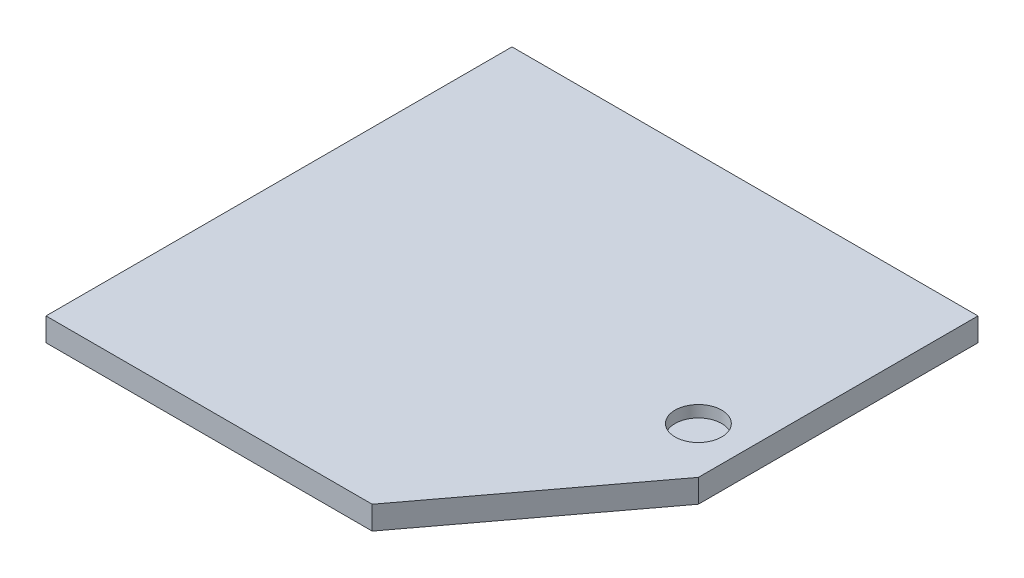
ISO-10303-21;
HEADER;
FILE_DESCRIPTION(('STEP AP214'),'2;1');
FILE_NAME('part.step','',(''),(''),'','','');
FILE_SCHEMA(('AUTOMOTIVE_DESIGN { 1 0 10303 214 1 1 1 1 }'));
ENDSEC;
DATA;
#1=APPLICATION_CONTEXT('core data for automotive mechanical design processes');
#2=APPLICATION_PROTOCOL_DEFINITION('international standard','automotive_design',2000,#1);
#3=PRODUCT_CONTEXT('',#1,'mechanical');
#4=PRODUCT('Part','Part','',(#3));
#5=PRODUCT_RELATED_PRODUCT_CATEGORY('part','',(#4));
#6=PRODUCT_DEFINITION_FORMATION('','',#4);
#7=PRODUCT_DEFINITION_CONTEXT('part definition',#1,'design');
#8=PRODUCT_DEFINITION('design','',#6,#7);
#9=PRODUCT_DEFINITION_SHAPE('','',#8);
#10=(LENGTH_UNIT() NAMED_UNIT(*) SI_UNIT(.MILLI.,.METRE.));
#11=(NAMED_UNIT(*) PLANE_ANGLE_UNIT() SI_UNIT($,.RADIAN.));
#12=(NAMED_UNIT(*) SI_UNIT($,.STERADIAN.) SOLID_ANGLE_UNIT());
#13=UNCERTAINTY_MEASURE_WITH_UNIT(LENGTH_MEASURE(1.E-05),#10,'distance_accuracy_value','');
#14=(GEOMETRIC_REPRESENTATION_CONTEXT(3) GLOBAL_UNCERTAINTY_ASSIGNED_CONTEXT((#13)) GLOBAL_UNIT_ASSIGNED_CONTEXT((#10,
#11,#12)) REPRESENTATION_CONTEXT('',''));
#15=CARTESIAN_POINT('',(0.,0.,0.));
#16=DIRECTION('',(0.,0.,1.));
#17=DIRECTION('',(1.,0.,0.));
#18=AXIS2_PLACEMENT_3D('',#15,#16,#17);
#19=CARTESIAN_POINT('',(0.,10.,0.));
#20=DIRECTION('',(1.,0.,0.));
#21=DIRECTION('',(0.,0.,-1.));
#22=AXIS2_PLACEMENT_3D('',#19,#20,#21);
#23=PLANE('',#22);
#24=DIRECTION('',(0.,0.,1.));
#25=VECTOR('',#24,1.);
#26=CARTESIAN_POINT('',(0.,0.,0.));
#27=LINE('',#26,#25);
#28=CARTESIAN_POINT('',(0.,0.,-200.));
#29=VERTEX_POINT('',#28);
#30=CARTESIAN_POINT('',(0.,0.,0.));
#31=VERTEX_POINT('',#30);
#32=EDGE_CURVE('E110',#29,#31,#27,.T.);
#33=ORIENTED_EDGE('',*,*,#32,.T.);
#34=DIRECTION('',(0.,-1.,0.));
#35=VECTOR('',#34,1.);
#36=CARTESIAN_POINT('',(0.,10.,0.));
#37=LINE('',#36,#35);
#38=CARTESIAN_POINT('',(0.,10.,0.));
#39=VERTEX_POINT('',#38);
#40=EDGE_CURVE('E11',#39,#31,#37,.T.);
#41=ORIENTED_EDGE('',*,*,#40,.F.);
#42=DIRECTION('',(0.,0.,1.));
#43=VECTOR('',#42,1.);
#44=CARTESIAN_POINT('',(0.,10.,0.));
#45=LINE('',#44,#43);
#46=CARTESIAN_POINT('',(0.,10.,-200.));
#47=VERTEX_POINT('',#46);
#48=EDGE_CURVE('E120',#47,#39,#45,.T.);
#49=ORIENTED_EDGE('',*,*,#48,.F.);
#50=DIRECTION('',(0.,-1.,0.));
#51=VECTOR('',#50,1.);
#52=CARTESIAN_POINT('',(0.,10.,-200.));
#53=LINE('',#52,#51);
#54=EDGE_CURVE('E106',#47,#29,#53,.T.);
#55=ORIENTED_EDGE('',*,*,#54,.T.);
#56=EDGE_LOOP('',(#33,#41,#49,#55));
#57=FACE_BOUND('',#56,.T.);
#58=ADVANCED_FACE('F35',(#57),#23,.F.);
#59=CARTESIAN_POINT('',(0.,10.,0.));
#60=DIRECTION('',(0.,0.,-1.));
#61=DIRECTION('',(-1.,0.,0.));
#62=AXIS2_PLACEMENT_3D('',#59,#60,#61);
#63=PLANE('',#62);
#64=DIRECTION('',(1.,0.,0.));
#65=VECTOR('',#64,1.);
#66=CARTESIAN_POINT('',(0.,0.,0.));
#67=LINE('',#66,#65);
#68=CARTESIAN_POINT('',(140.,0.,0.));
#69=VERTEX_POINT('',#68);
#70=EDGE_CURVE('E113',#31,#69,#67,.T.);
#71=ORIENTED_EDGE('',*,*,#70,.T.);
#72=DIRECTION('',(0.,-1.,0.));
#73=VECTOR('',#72,1.);
#74=CARTESIAN_POINT('',(140.,10.,0.));
#75=LINE('',#74,#73);
#76=CARTESIAN_POINT('',(140.,10.,0.));
#77=VERTEX_POINT('',#76);
#78=EDGE_CURVE('E43',#77,#69,#75,.T.);
#79=ORIENTED_EDGE('',*,*,#78,.F.);
#80=DIRECTION('',(1.,0.,0.));
#81=VECTOR('',#80,1.);
#82=CARTESIAN_POINT('',(0.,10.,0.));
#83=LINE('',#82,#81);
#84=EDGE_CURVE('E82',#39,#77,#83,.T.);
#85=ORIENTED_EDGE('',*,*,#84,.F.);
#86=ORIENTED_EDGE('',*,*,#40,.T.);
#87=EDGE_LOOP('',(#71,#79,#85,#86));
#88=FACE_BOUND('',#87,.T.);
#89=ADVANCED_FACE('F152',(#88),#63,.F.);
#90=CARTESIAN_POINT('',(200.,10.,-80.));
#91=DIRECTION('',(-0.8,0.,-0.6));
#92=DIRECTION('',(-0.6,0.,0.8));
#93=AXIS2_PLACEMENT_3D('',#90,#91,#92);
#94=PLANE('',#93);
#95=DIRECTION('',(0.6,0.,-0.8));
#96=VECTOR('',#95,1.);
#97=CARTESIAN_POINT('',(200.,0.,-80.));
#98=LINE('',#97,#96);
#99=CARTESIAN_POINT('',(200.,0.,-80.));
#100=VERTEX_POINT('',#99);
#101=EDGE_CURVE('E100',#69,#100,#98,.T.);
#102=ORIENTED_EDGE('',*,*,#101,.T.);
#103=DIRECTION('',(0.,-1.,0.));
#104=VECTOR('',#103,1.);
#105=CARTESIAN_POINT('',(200.,10.,-80.));
#106=LINE('',#105,#104);
#107=CARTESIAN_POINT('',(200.,10.,-80.));
#108=VERTEX_POINT('',#107);
#109=EDGE_CURVE('E97',#108,#100,#106,.T.);
#110=ORIENTED_EDGE('',*,*,#109,.F.);
#111=DIRECTION('',(0.6,0.,-0.8));
#112=VECTOR('',#111,1.);
#113=CARTESIAN_POINT('',(200.,10.,-80.));
#114=LINE('',#113,#112);
#115=EDGE_CURVE('E86',#77,#108,#114,.T.);
#116=ORIENTED_EDGE('',*,*,#115,.F.);
#117=ORIENTED_EDGE('',*,*,#78,.T.);
#118=EDGE_LOOP('',(#102,#110,#116,#117));
#119=FACE_BOUND('',#118,.T.);
#120=ADVANCED_FACE('F98',(#119),#94,.F.);
#121=CARTESIAN_POINT('',(200.,10.,-200.));
#122=DIRECTION('',(-1.,0.,0.));
#123=DIRECTION('',(0.,0.,1.));
#124=AXIS2_PLACEMENT_3D('',#121,#122,#123);
#125=PLANE('',#124);
#126=DIRECTION('',(0.,0.,-1.));
#127=VECTOR('',#126,1.);
#128=CARTESIAN_POINT('',(200.,0.,-200.));
#129=LINE('',#128,#127);
#130=CARTESIAN_POINT('',(200.,0.,-200.));
#131=VERTEX_POINT('',#130);
#132=EDGE_CURVE('E117',#100,#131,#129,.T.);
#133=ORIENTED_EDGE('',*,*,#132,.T.);
#134=DIRECTION('',(0.,-1.,0.));
#135=VECTOR('',#134,1.);
#136=CARTESIAN_POINT('',(200.,10.,-200.));
#137=LINE('',#136,#135);
#138=CARTESIAN_POINT('',(200.,10.,-200.));
#139=VERTEX_POINT('',#138);
#140=EDGE_CURVE('E102',#139,#131,#137,.T.);
#141=ORIENTED_EDGE('',*,*,#140,.F.);
#142=DIRECTION('',(0.,0.,-1.));
#143=VECTOR('',#142,1.);
#144=CARTESIAN_POINT('',(200.,10.,-80.));
#145=LINE('',#144,#143);
#146=EDGE_CURVE('E90',#108,#139,#145,.T.);
#147=ORIENTED_EDGE('',*,*,#146,.F.);
#148=ORIENTED_EDGE('',*,*,#109,.T.);
#149=EDGE_LOOP('',(#133,#141,#147,#148));
#150=FACE_BOUND('',#149,.T.);
#151=ADVANCED_FACE('F104',(#150),#125,.F.);
#152=CARTESIAN_POINT('',(0.,10.,-200.));
#153=DIRECTION('',(0.,0.,1.));
#154=DIRECTION('',(1.,0.,0.));
#155=AXIS2_PLACEMENT_3D('',#152,#153,#154);
#156=PLANE('',#155);
#157=DIRECTION('',(-1.,0.,0.));
#158=VECTOR('',#157,1.);
#159=CARTESIAN_POINT('',(0.,0.,-200.));
#160=LINE('',#159,#158);
#161=EDGE_CURVE('E70',#131,#29,#160,.T.);
#162=ORIENTED_EDGE('',*,*,#161,.T.);
#163=ORIENTED_EDGE('',*,*,#54,.F.);
#164=DIRECTION('',(-1.,0.,0.));
#165=VECTOR('',#164,1.);
#166=CARTESIAN_POINT('',(140.,10.,-200.));
#167=LINE('',#166,#165);
#168=EDGE_CURVE('E51',#139,#47,#167,.T.);
#169=ORIENTED_EDGE('',*,*,#168,.F.);
#170=ORIENTED_EDGE('',*,*,#140,.T.);
#171=EDGE_LOOP('',(#162,#163,#169,#170));
#172=FACE_BOUND('',#171,.T.);
#173=ADVANCED_FACE('F123',(#172),#156,.F.);
#174=CARTESIAN_POINT('',(0.,10.,0.));
#175=DIRECTION('',(0.,-1.,0.));
#176=DIRECTION('',(0.,0.,-1.));
#177=AXIS2_PLACEMENT_3D('',#174,#175,#176);
#178=PLANE('',#177);
#179=CARTESIAN_POINT('',(180.,10.,-100.));
#180=DIRECTION('',(0.,1.,0.));
#181=DIRECTION('',(0.,0.,1.));
#182=AXIS2_PLACEMENT_3D('',#179,#180,#181);
#183=CIRCLE('',#182,10.);
#184=CARTESIAN_POINT('',(180.,10.,-90.));
#185=VERTEX_POINT('',#184);
#186=EDGE_CURVE('E129',#185,#185,#183,.T.);
#187=ORIENTED_EDGE('',*,*,#186,.F.);
#188=EDGE_LOOP('',(#187));
#189=FACE_BOUND('',#188,.T.);
#190=ORIENTED_EDGE('',*,*,#48,.T.);
#191=ORIENTED_EDGE('',*,*,#84,.T.);
#192=ORIENTED_EDGE('',*,*,#115,.T.);
#193=ORIENTED_EDGE('',*,*,#146,.T.);
#194=ORIENTED_EDGE('',*,*,#168,.T.);
#195=EDGE_LOOP('',(#190,#191,#192,#193,#194));
#196=FACE_BOUND('',#195,.T.);
#197=ADVANCED_FACE('F88',(#189,#196),#178,.F.);
#198=CARTESIAN_POINT('',(0.,0.,0.));
#199=DIRECTION('',(0.,-1.,0.));
#200=DIRECTION('',(0.,0.,-1.));
#201=AXIS2_PLACEMENT_3D('',#198,#199,#200);
#202=PLANE('',#201);
#203=ORIENTED_EDGE('',*,*,#32,.F.);
#204=ORIENTED_EDGE('',*,*,#161,.F.);
#205=ORIENTED_EDGE('',*,*,#132,.F.);
#206=ORIENTED_EDGE('',*,*,#101,.F.);
#207=ORIENTED_EDGE('',*,*,#70,.F.);
#208=EDGE_LOOP('',(#203,#204,#205,#206,#207));
#209=FACE_BOUND('',#208,.T.);
#210=ADVANCED_FACE('F122',(#209),#202,.T.);
#211=CARTESIAN_POINT('',(180.,5.,-100.));
#212=DIRECTION('',(0.,1.,0.));
#213=DIRECTION('',(0.,0.,1.));
#214=AXIS2_PLACEMENT_3D('',#211,#212,#213);
#215=CYLINDRICAL_SURFACE('',#214,10.);
#216=CARTESIAN_POINT('',(180.,5.,-100.));
#217=DIRECTION('',(0.,1.,0.));
#218=DIRECTION('',(0.,0.,1.));
#219=AXIS2_PLACEMENT_3D('',#216,#217,#218);
#220=CIRCLE('',#219,10.);
#221=CARTESIAN_POINT('',(180.,5.,-90.));
#222=VERTEX_POINT('',#221);
#223=EDGE_CURVE('E114',#222,#222,#220,.T.);
#224=ORIENTED_EDGE('',*,*,#223,.F.);
#225=EDGE_LOOP('',(#224));
#226=FACE_BOUND('',#225,.T.);
#227=ORIENTED_EDGE('',*,*,#186,.T.);
#228=EDGE_LOOP('',(#227));
#229=FACE_BOUND('',#228,.T.);
#230=ADVANCED_FACE('F137',(#226,#229),#215,.F.);
#231=CARTESIAN_POINT('',(180.,5.,-100.));
#232=DIRECTION('',(0.,1.,0.));
#233=DIRECTION('',(0.,0.,1.));
#234=AXIS2_PLACEMENT_3D('',#231,#232,#233);
#235=PLANE('',#234);
#236=ORIENTED_EDGE('',*,*,#223,.T.);
#237=EDGE_LOOP('',(#236));
#238=FACE_BOUND('',#237,.T.);
#239=ADVANCED_FACE('F135',(#238),#235,.T.);
#240=CLOSED_SHELL('',(#58,#89,#120,#151,#173,#197,#210,#230,#239));
#241=MANIFOLD_SOLID_BREP('B2',#240);
#242=ADVANCED_BREP_SHAPE_REPRESENTATION('',(#18,#241),#14);
#243=SHAPE_DEFINITION_REPRESENTATION(#9,#242);
ENDSEC;
END-ISO-10303-21;
